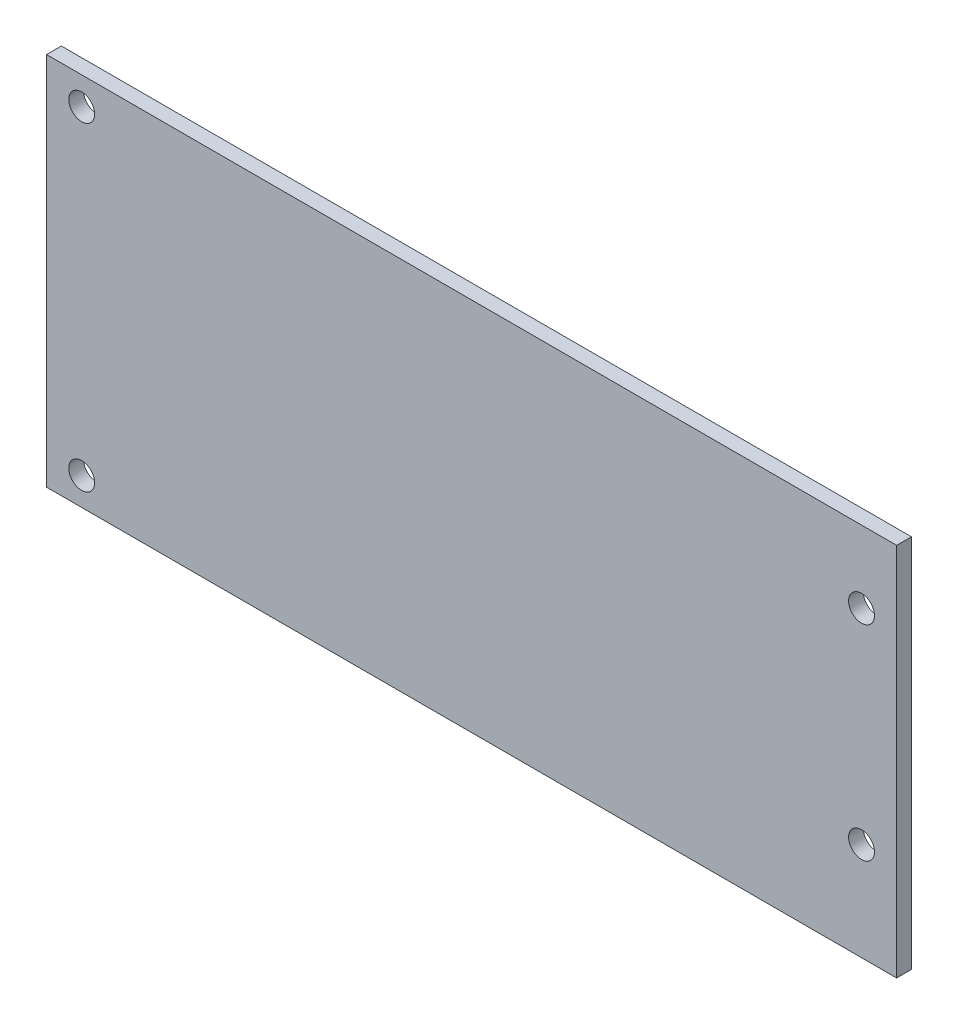
ISO-10303-21;
HEADER;
FILE_DESCRIPTION(('STEP AP214'),'2;1');
FILE_NAME('part.step','',(''),(''),'','','');
FILE_SCHEMA(('AUTOMOTIVE_DESIGN { 1 0 10303 214 1 1 1 1 }'));
ENDSEC;
DATA;
#1=APPLICATION_CONTEXT('core data for automotive mechanical design processes');
#2=APPLICATION_PROTOCOL_DEFINITION('international standard','automotive_design',2000,#1);
#3=PRODUCT_CONTEXT('',#1,'mechanical');
#4=PRODUCT('Part','Part','',(#3));
#5=PRODUCT_RELATED_PRODUCT_CATEGORY('part','',(#4));
#6=PRODUCT_DEFINITION_FORMATION('','',#4);
#7=PRODUCT_DEFINITION_CONTEXT('part definition',#1,'design');
#8=PRODUCT_DEFINITION('design','',#6,#7);
#9=PRODUCT_DEFINITION_SHAPE('','',#8);
#10=(LENGTH_UNIT() NAMED_UNIT(*) SI_UNIT(.MILLI.,.METRE.));
#11=(NAMED_UNIT(*) PLANE_ANGLE_UNIT() SI_UNIT($,.RADIAN.));
#12=(NAMED_UNIT(*) SI_UNIT($,.STERADIAN.) SOLID_ANGLE_UNIT());
#13=UNCERTAINTY_MEASURE_WITH_UNIT(LENGTH_MEASURE(1.E-05),#10,'distance_accuracy_value','');
#14=(GEOMETRIC_REPRESENTATION_CONTEXT(3) GLOBAL_UNCERTAINTY_ASSIGNED_CONTEXT((#13)) GLOBAL_UNIT_ASSIGNED_CONTEXT((#10,
#11,#12)) REPRESENTATION_CONTEXT('',''));
#15=CARTESIAN_POINT('',(0.,0.,0.));
#16=DIRECTION('',(0.,0.,1.));
#17=DIRECTION('',(1.,0.,0.));
#18=AXIS2_PLACEMENT_3D('',#15,#16,#17);
#19=CARTESIAN_POINT('',(0.,0.,2.));
#20=DIRECTION('',(0.,0.,1.));
#21=DIRECTION('',(1.,0.,0.));
#22=AXIS2_PLACEMENT_3D('',#19,#20,#21);
#23=PLANE('',#22);
#24=DIRECTION('',(0.,-1.,0.));
#25=VECTOR('',#24,1.);
#26=CARTESIAN_POINT('',(-56.3656382998155,34.3300783604581,2.));
#27=LINE('',#26,#25);
#28=CARTESIAN_POINT('',(-56.3656382998155,34.3300783604581,2.));
#29=VERTEX_POINT('',#28);
#30=CARTESIAN_POINT('',(-56.3656382998155,-16.3611668219263,2.));
#31=VERTEX_POINT('',#30);
#32=EDGE_CURVE('E84',#29,#31,#27,.T.);
#33=ORIENTED_EDGE('',*,*,#32,.T.);
#34=DIRECTION('',(1.,0.,0.));
#35=VECTOR('',#34,1.);
#36=CARTESIAN_POINT('',(-56.3656382998155,-16.3611668219263,2.));
#37=LINE('',#36,#35);
#38=CARTESIAN_POINT('',(58.6343617001845,-16.3611668219263,2.));
#39=VERTEX_POINT('',#38);
#40=EDGE_CURVE('E79',#31,#39,#37,.T.);
#41=ORIENTED_EDGE('',*,*,#40,.T.);
#42=DIRECTION('',(0.,1.,0.));
#43=VECTOR('',#42,1.);
#44=CARTESIAN_POINT('',(58.6343617001845,34.3300783604581,2.));
#45=LINE('',#44,#43);
#46=CARTESIAN_POINT('',(58.6343617001845,34.3300783604581,2.));
#47=VERTEX_POINT('',#46);
#48=EDGE_CURVE('E82',#39,#47,#45,.T.);
#49=ORIENTED_EDGE('',*,*,#48,.T.);
#50=DIRECTION('',(-1.,0.,0.));
#51=VECTOR('',#50,1.);
#52=CARTESIAN_POINT('',(-56.3656382998155,34.3300783604581,2.));
#53=LINE('',#52,#51);
#54=EDGE_CURVE('E49',#47,#29,#53,.T.);
#55=ORIENTED_EDGE('',*,*,#54,.T.);
#56=EDGE_LOOP('',(#33,#41,#49,#55));
#57=FACE_BOUND('',#56,.T.);
#58=CARTESIAN_POINT('',(-51.6156382998155,30.5800783604581,2.));
#59=DIRECTION('',(0.,0.,1.));
#60=DIRECTION('',(1.,0.,0.));
#61=AXIS2_PLACEMENT_3D('',#58,#59,#60);
#62=CIRCLE('',#61,1.75);
#63=CARTESIAN_POINT('',(-49.8656382998155,30.5800783604581,2.));
#64=VERTEX_POINT('',#63);
#65=EDGE_CURVE('E111',#64,#64,#62,.T.);
#66=ORIENTED_EDGE('',*,*,#65,.F.);
#67=EDGE_LOOP('',(#66));
#68=FACE_BOUND('',#67,.T.);
#69=CARTESIAN_POINT('',(53.8843617001845,24.5800783604581,2.));
#70=DIRECTION('',(0.,0.,1.));
#71=DIRECTION('',(1.,0.,0.));
#72=AXIS2_PLACEMENT_3D('',#69,#70,#71);
#73=CIRCLE('',#72,1.75);
#74=CARTESIAN_POINT('',(55.6343617001845,24.5800783604581,2.));
#75=VERTEX_POINT('',#74);
#76=EDGE_CURVE('E117',#75,#75,#73,.T.);
#77=ORIENTED_EDGE('',*,*,#76,.F.);
#78=EDGE_LOOP('',(#77));
#79=FACE_BOUND('',#78,.T.);
#80=CARTESIAN_POINT('',(53.8843617001844,-3.11116682192632,2.));
#81=DIRECTION('',(0.,0.,1.));
#82=DIRECTION('',(1.,0.,0.));
#83=AXIS2_PLACEMENT_3D('',#80,#81,#82);
#84=CIRCLE('',#83,1.75);
#85=CARTESIAN_POINT('',(55.6343617001844,-3.11116682192632,2.));
#86=VERTEX_POINT('',#85);
#87=EDGE_CURVE('E123',#86,#86,#84,.T.);
#88=ORIENTED_EDGE('',*,*,#87,.F.);
#89=EDGE_LOOP('',(#88));
#90=FACE_BOUND('',#89,.T.);
#91=CARTESIAN_POINT('',(-51.6156382998155,-12.6111668219263,2.));
#92=DIRECTION('',(0.,0.,1.));
#93=DIRECTION('',(1.,0.,0.));
#94=AXIS2_PLACEMENT_3D('',#91,#92,#93);
#95=CIRCLE('',#94,1.75);
#96=CARTESIAN_POINT('',(-49.8656382998155,-12.6111668219263,2.));
#97=VERTEX_POINT('',#96);
#98=EDGE_CURVE('E129',#97,#97,#95,.F.);
#99=ORIENTED_EDGE('',*,*,#98,.T.);
#100=EDGE_LOOP('',(#99));
#101=FACE_BOUND('',#100,.T.);
#102=ADVANCED_FACE('F32',(#57,#68,#79,#90,#101),#23,.T.);
#103=CARTESIAN_POINT('',(0.,0.,0.));
#104=DIRECTION('',(0.,0.,1.));
#105=DIRECTION('',(1.,0.,0.));
#106=AXIS2_PLACEMENT_3D('',#103,#104,#105);
#107=PLANE('',#106);
#108=CARTESIAN_POINT('',(53.8843617001844,-3.11116682192632,0.));
#109=DIRECTION('',(0.,0.,1.));
#110=DIRECTION('',(1.,0.,0.));
#111=AXIS2_PLACEMENT_3D('',#108,#109,#110);
#112=CIRCLE('',#111,1.75);
#113=CARTESIAN_POINT('',(55.6343617001844,-3.11116682192632,0.));
#114=VERTEX_POINT('',#113);
#115=EDGE_CURVE('E126',#114,#114,#112,.T.);
#116=ORIENTED_EDGE('',*,*,#115,.T.);
#117=EDGE_LOOP('',(#116));
#118=FACE_BOUND('',#117,.T.);
#119=CARTESIAN_POINT('',(53.8843617001845,24.5800783604581,0.));
#120=DIRECTION('',(0.,0.,1.));
#121=DIRECTION('',(1.,0.,0.));
#122=AXIS2_PLACEMENT_3D('',#119,#120,#121);
#123=CIRCLE('',#122,1.75);
#124=CARTESIAN_POINT('',(55.6343617001845,24.5800783604581,0.));
#125=VERTEX_POINT('',#124);
#126=EDGE_CURVE('E120',#125,#125,#123,.T.);
#127=ORIENTED_EDGE('',*,*,#126,.T.);
#128=EDGE_LOOP('',(#127));
#129=FACE_BOUND('',#128,.T.);
#130=CARTESIAN_POINT('',(-51.6156382998155,30.5800783604581,0.));
#131=DIRECTION('',(0.,0.,1.));
#132=DIRECTION('',(1.,0.,0.));
#133=AXIS2_PLACEMENT_3D('',#130,#131,#132);
#134=CIRCLE('',#133,1.75);
#135=CARTESIAN_POINT('',(-49.8656382998155,30.5800783604581,0.));
#136=VERTEX_POINT('',#135);
#137=EDGE_CURVE('E114',#136,#136,#134,.T.);
#138=ORIENTED_EDGE('',*,*,#137,.T.);
#139=EDGE_LOOP('',(#138));
#140=FACE_BOUND('',#139,.T.);
#141=DIRECTION('',(0.,-1.,0.));
#142=VECTOR('',#141,1.);
#143=CARTESIAN_POINT('',(-56.3656382998155,34.3300783604581,0.));
#144=LINE('',#143,#142);
#145=CARTESIAN_POINT('',(-56.3656382998155,34.3300783604581,0.));
#146=VERTEX_POINT('',#145);
#147=CARTESIAN_POINT('',(-56.3656382998155,-16.3611668219263,0.));
#148=VERTEX_POINT('',#147);
#149=EDGE_CURVE('E96',#146,#148,#144,.T.);
#150=ORIENTED_EDGE('',*,*,#149,.F.);
#151=DIRECTION('',(-1.,0.,0.));
#152=VECTOR('',#151,1.);
#153=CARTESIAN_POINT('',(-56.3656382998155,34.3300783604581,0.));
#154=LINE('',#153,#152);
#155=CARTESIAN_POINT('',(58.6343617001845,34.3300783604581,0.));
#156=VERTEX_POINT('',#155);
#157=EDGE_CURVE('E72',#156,#146,#154,.T.);
#158=ORIENTED_EDGE('',*,*,#157,.F.);
#159=DIRECTION('',(0.,1.,0.));
#160=VECTOR('',#159,1.);
#161=CARTESIAN_POINT('',(58.6343617001845,34.3300783604581,0.));
#162=LINE('',#161,#160);
#163=CARTESIAN_POINT('',(58.6343617001845,-16.3611668219263,0.));
#164=VERTEX_POINT('',#163);
#165=EDGE_CURVE('E66',#164,#156,#162,.T.);
#166=ORIENTED_EDGE('',*,*,#165,.F.);
#167=DIRECTION('',(1.,0.,0.));
#168=VECTOR('',#167,1.);
#169=CARTESIAN_POINT('',(-56.3656382998155,-16.3611668219263,0.));
#170=LINE('',#169,#168);
#171=EDGE_CURVE('E88',#148,#164,#170,.T.);
#172=ORIENTED_EDGE('',*,*,#171,.F.);
#173=EDGE_LOOP('',(#150,#158,#166,#172));
#174=FACE_BOUND('',#173,.T.);
#175=CARTESIAN_POINT('',(-51.6156382998155,-12.6111668219263,0.));
#176=DIRECTION('',(0.,0.,1.));
#177=DIRECTION('',(1.,0.,0.));
#178=AXIS2_PLACEMENT_3D('',#175,#176,#177);
#179=CIRCLE('',#178,1.75);
#180=CARTESIAN_POINT('',(-49.8656382998155,-12.6111668219263,0.));
#181=VERTEX_POINT('',#180);
#182=EDGE_CURVE('E99',#181,#181,#179,.F.);
#183=ORIENTED_EDGE('',*,*,#182,.F.);
#184=EDGE_LOOP('',(#183));
#185=FACE_BOUND('',#184,.T.);
#186=ADVANCED_FACE('F107',(#118,#129,#140,#174,#185),#107,.F.);
#187=CARTESIAN_POINT('',(-56.3656382998155,34.3300783604581,2.));
#188=DIRECTION('',(1.,0.,0.));
#189=DIRECTION('',(0.,0.,-1.));
#190=AXIS2_PLACEMENT_3D('',#187,#188,#189);
#191=PLANE('',#190);
#192=ORIENTED_EDGE('',*,*,#149,.T.);
#193=DIRECTION('',(0.,0.,-1.));
#194=VECTOR('',#193,1.);
#195=CARTESIAN_POINT('',(-56.3656382998155,-16.3611668219263,2.));
#196=LINE('',#195,#194);
#197=EDGE_CURVE('E11',#31,#148,#196,.T.);
#198=ORIENTED_EDGE('',*,*,#197,.F.);
#199=ORIENTED_EDGE('',*,*,#32,.F.);
#200=DIRECTION('',(0.,0.,-1.));
#201=VECTOR('',#200,1.);
#202=CARTESIAN_POINT('',(-56.3656382998155,34.3300783604581,2.));
#203=LINE('',#202,#201);
#204=EDGE_CURVE('E92',#29,#146,#203,.T.);
#205=ORIENTED_EDGE('',*,*,#204,.T.);
#206=EDGE_LOOP('',(#192,#198,#199,#205));
#207=FACE_BOUND('',#206,.T.);
#208=ADVANCED_FACE('F34',(#207),#191,.F.);
#209=CARTESIAN_POINT('',(-56.3656382998155,-16.3611668219263,2.));
#210=DIRECTION('',(0.,1.,0.));
#211=DIRECTION('',(0.,0.,1.));
#212=AXIS2_PLACEMENT_3D('',#209,#210,#211);
#213=PLANE('',#212);
#214=ORIENTED_EDGE('',*,*,#171,.T.);
#215=DIRECTION('',(0.,0.,-1.));
#216=VECTOR('',#215,1.);
#217=CARTESIAN_POINT('',(58.6343617001845,-16.3611668219263,2.));
#218=LINE('',#217,#216);
#219=EDGE_CURVE('E41',#39,#164,#218,.T.);
#220=ORIENTED_EDGE('',*,*,#219,.F.);
#221=ORIENTED_EDGE('',*,*,#40,.F.);
#222=ORIENTED_EDGE('',*,*,#197,.T.);
#223=EDGE_LOOP('',(#214,#220,#221,#222));
#224=FACE_BOUND('',#223,.T.);
#225=ADVANCED_FACE('F87',(#224),#213,.F.);
#226=CARTESIAN_POINT('',(58.6343617001845,34.3300783604581,2.));
#227=DIRECTION('',(-1.,0.,0.));
#228=DIRECTION('',(0.,-1.,0.));
#229=AXIS2_PLACEMENT_3D('',#226,#227,#228);
#230=PLANE('',#229);
#231=ORIENTED_EDGE('',*,*,#165,.T.);
#232=DIRECTION('',(0.,0.,-1.));
#233=VECTOR('',#232,1.);
#234=CARTESIAN_POINT('',(58.6343617001845,34.3300783604581,2.));
#235=LINE('',#234,#233);
#236=EDGE_CURVE('E89',#47,#156,#235,.T.);
#237=ORIENTED_EDGE('',*,*,#236,.F.);
#238=ORIENTED_EDGE('',*,*,#48,.F.);
#239=ORIENTED_EDGE('',*,*,#219,.T.);
#240=EDGE_LOOP('',(#231,#237,#238,#239));
#241=FACE_BOUND('',#240,.T.);
#242=ADVANCED_FACE('F90',(#241),#230,.F.);
#243=CARTESIAN_POINT('',(-56.3656382998155,34.3300783604581,2.));
#244=DIRECTION('',(0.,-1.,0.));
#245=DIRECTION('',(0.,0.,-1.));
#246=AXIS2_PLACEMENT_3D('',#243,#244,#245);
#247=PLANE('',#246);
#248=ORIENTED_EDGE('',*,*,#157,.T.);
#249=ORIENTED_EDGE('',*,*,#204,.F.);
#250=ORIENTED_EDGE('',*,*,#54,.F.);
#251=ORIENTED_EDGE('',*,*,#236,.T.);
#252=EDGE_LOOP('',(#248,#249,#250,#251));
#253=FACE_BOUND('',#252,.T.);
#254=ADVANCED_FACE('F104',(#253),#247,.F.);
#255=CARTESIAN_POINT('',(-51.6156382998155,30.5800783604581,0.));
#256=DIRECTION('',(0.,0.,1.));
#257=DIRECTION('',(1.,0.,0.));
#258=AXIS2_PLACEMENT_3D('',#255,#256,#257);
#259=CYLINDRICAL_SURFACE('',#258,1.75);
#260=ORIENTED_EDGE('',*,*,#137,.F.);
#261=EDGE_LOOP('',(#260));
#262=FACE_BOUND('',#261,.T.);
#263=ORIENTED_EDGE('',*,*,#65,.T.);
#264=EDGE_LOOP('',(#263));
#265=FACE_BOUND('',#264,.T.);
#266=ADVANCED_FACE('F151',(#262,#265),#259,.F.);
#267=CARTESIAN_POINT('',(53.8843617001845,24.5800783604581,0.));
#268=DIRECTION('',(0.,0.,1.));
#269=DIRECTION('',(1.,0.,0.));
#270=AXIS2_PLACEMENT_3D('',#267,#268,#269);
#271=CYLINDRICAL_SURFACE('',#270,1.75);
#272=ORIENTED_EDGE('',*,*,#126,.F.);
#273=EDGE_LOOP('',(#272));
#274=FACE_BOUND('',#273,.T.);
#275=ORIENTED_EDGE('',*,*,#76,.T.);
#276=EDGE_LOOP('',(#275));
#277=FACE_BOUND('',#276,.T.);
#278=ADVANCED_FACE('F181',(#274,#277),#271,.F.);
#279=CARTESIAN_POINT('',(53.8843617001844,-3.11116682192632,0.));
#280=DIRECTION('',(0.,0.,1.));
#281=DIRECTION('',(1.,0.,0.));
#282=AXIS2_PLACEMENT_3D('',#279,#280,#281);
#283=CYLINDRICAL_SURFACE('',#282,1.75);
#284=ORIENTED_EDGE('',*,*,#115,.F.);
#285=EDGE_LOOP('',(#284));
#286=FACE_BOUND('',#285,.T.);
#287=ORIENTED_EDGE('',*,*,#87,.T.);
#288=EDGE_LOOP('',(#287));
#289=FACE_BOUND('',#288,.T.);
#290=ADVANCED_FACE('F187',(#286,#289),#283,.F.);
#291=CARTESIAN_POINT('',(-51.6156382998155,-12.6111668219263,0.));
#292=DIRECTION('',(0.,0.,1.));
#293=DIRECTION('',(1.,0.,0.));
#294=AXIS2_PLACEMENT_3D('',#291,#292,#293);
#295=CYLINDRICAL_SURFACE('',#294,1.75);
#296=ORIENTED_EDGE('',*,*,#182,.T.);
#297=EDGE_LOOP('',(#296));
#298=FACE_BOUND('',#297,.T.);
#299=ORIENTED_EDGE('',*,*,#98,.F.);
#300=EDGE_LOOP('',(#299));
#301=FACE_BOUND('',#300,.T.);
#302=ADVANCED_FACE('F135',(#298,#301),#295,.F.);
#303=CLOSED_SHELL('',(#102,#186,#208,#225,#242,#254,#266,#278,#290,#302));
#304=MANIFOLD_SOLID_BREP('B2',#303);
#305=ADVANCED_BREP_SHAPE_REPRESENTATION('',(#18,#304),#14);
#306=SHAPE_DEFINITION_REPRESENTATION(#9,#305);
ENDSEC;
END-ISO-10303-21;
